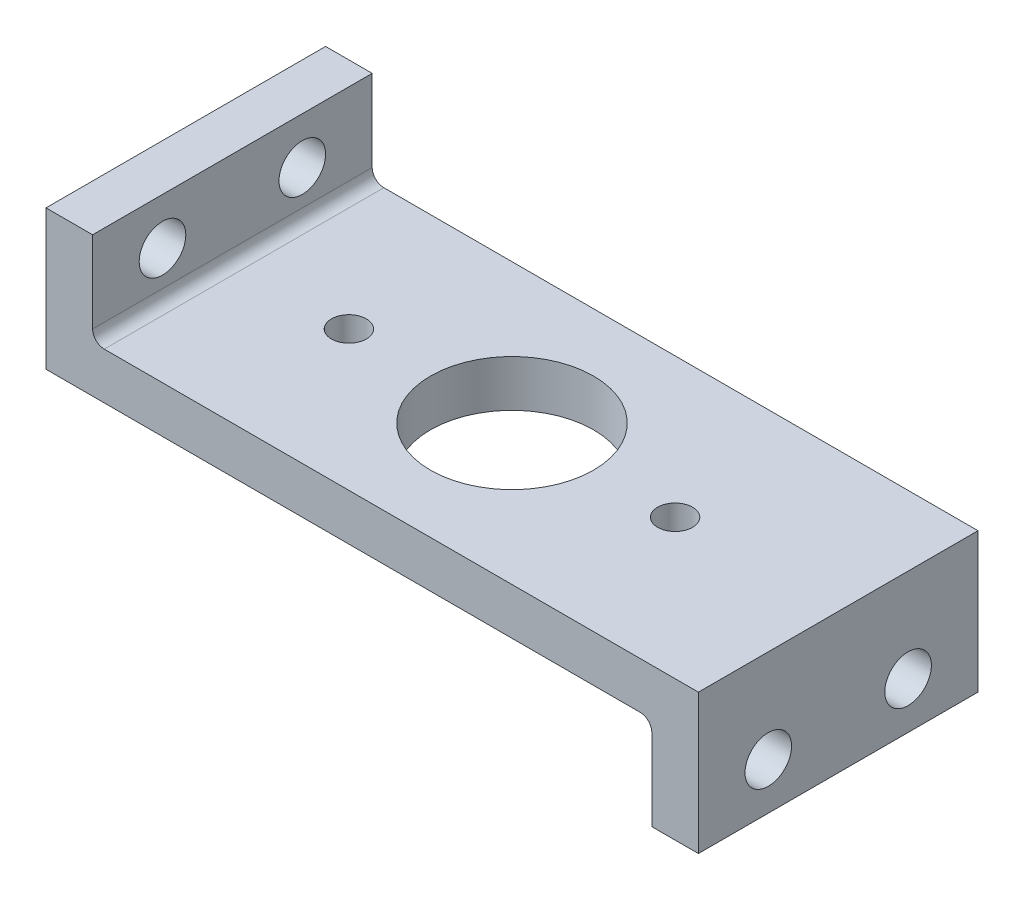
ISO-10303-21;
HEADER;
FILE_DESCRIPTION(('STEP AP214'),'2;1');
FILE_NAME('part.step','',(''),(''),'','','');
FILE_SCHEMA(('AUTOMOTIVE_DESIGN { 1 0 10303 214 1 1 1 1 }'));
ENDSEC;
DATA;
#1=APPLICATION_CONTEXT('core data for automotive mechanical design processes');
#2=APPLICATION_PROTOCOL_DEFINITION('international standard','automotive_design',2000,#1);
#3=PRODUCT_CONTEXT('',#1,'mechanical');
#4=PRODUCT('Part','Part','',(#3));
#5=PRODUCT_RELATED_PRODUCT_CATEGORY('part','',(#4));
#6=PRODUCT_DEFINITION_FORMATION('','',#4);
#7=PRODUCT_DEFINITION_CONTEXT('part definition',#1,'design');
#8=PRODUCT_DEFINITION('design','',#6,#7);
#9=PRODUCT_DEFINITION_SHAPE('','',#8);
#10=(LENGTH_UNIT() NAMED_UNIT(*) SI_UNIT(.MILLI.,.METRE.));
#11=(NAMED_UNIT(*) PLANE_ANGLE_UNIT() SI_UNIT($,.RADIAN.));
#12=(NAMED_UNIT(*) SI_UNIT($,.STERADIAN.) SOLID_ANGLE_UNIT());
#13=UNCERTAINTY_MEASURE_WITH_UNIT(LENGTH_MEASURE(1.E-05),#10,'distance_accuracy_value','');
#14=(GEOMETRIC_REPRESENTATION_CONTEXT(3) GLOBAL_UNCERTAINTY_ASSIGNED_CONTEXT((#13)) GLOBAL_UNIT_ASSIGNED_CONTEXT((#10,
#11,#12)) REPRESENTATION_CONTEXT('',''));
#15=CARTESIAN_POINT('',(0.,0.,0.));
#16=DIRECTION('',(0.,0.,1.));
#17=DIRECTION('',(1.,0.,0.));
#18=AXIS2_PLACEMENT_3D('',#15,#16,#17);
#19=CARTESIAN_POINT('',(0.,0.,0.));
#20=DIRECTION('',(0.,1.,0.));
#21=DIRECTION('',(0.,0.,1.));
#22=AXIS2_PLACEMENT_3D('',#19,#20,#21);
#23=PLANE('',#22);
#24=CARTESIAN_POINT('',(44.45,0.,0.));
#25=DIRECTION('',(0.,1.,0.));
#26=DIRECTION('',(0.,0.,1.));
#27=AXIS2_PLACEMENT_3D('',#24,#25,#26);
#28=CIRCLE('',#27,4.7625);
#29=CARTESIAN_POINT('',(44.45,0.,4.7625));
#30=VERTEX_POINT('',#29);
#31=EDGE_CURVE('E199',#30,#30,#28,.T.);
#32=ORIENTED_EDGE('',*,*,#31,.T.);
#33=EDGE_LOOP('',(#32));
#34=FACE_BOUND('',#33,.T.);
#35=CARTESIAN_POINT('',(-44.45,0.,0.));
#36=DIRECTION('',(0.,1.,0.));
#37=DIRECTION('',(0.,0.,1.));
#38=AXIS2_PLACEMENT_3D('',#35,#36,#37);
#39=CIRCLE('',#38,4.7625);
#40=CARTESIAN_POINT('',(-44.45,0.,4.7625));
#41=VERTEX_POINT('',#40);
#42=EDGE_CURVE('E204',#41,#41,#39,.T.);
#43=ORIENTED_EDGE('',*,*,#42,.T.);
#44=EDGE_LOOP('',(#43));
#45=FACE_BOUND('',#44,.T.);
#46=CARTESIAN_POINT('',(0.,0.,0.));
#47=DIRECTION('',(0.,1.,0.));
#48=DIRECTION('',(0.,0.,1.));
#49=AXIS2_PLACEMENT_3D('',#46,#47,#48);
#50=CIRCLE('',#49,22.225);
#51=CARTESIAN_POINT('',(0.,0.,22.225));
#52=VERTEX_POINT('',#51);
#53=EDGE_CURVE('E212',#52,#52,#50,.T.);
#54=ORIENTED_EDGE('',*,*,#53,.T.);
#55=EDGE_LOOP('',(#54));
#56=FACE_BOUND('',#55,.T.);
#57=DIRECTION('',(-1.,0.,0.));
#58=VECTOR('',#57,1.);
#59=CARTESIAN_POINT('',(-88.9,0.,-38.1));
#60=LINE('',#59,#58);
#61=CARTESIAN_POINT('',(73.025,0.,-38.1));
#62=VERTEX_POINT('',#61);
#63=CARTESIAN_POINT('',(-88.9,0.,-38.1));
#64=VERTEX_POINT('',#63);
#65=EDGE_CURVE('E227',#62,#64,#60,.T.);
#66=ORIENTED_EDGE('',*,*,#65,.F.);
#67=DIRECTION('',(0.,0.,-1.));
#68=VECTOR('',#67,1.);
#69=CARTESIAN_POINT('',(73.025,0.,38.1));
#70=LINE('',#69,#68);
#71=CARTESIAN_POINT('',(73.025,0.,38.1));
#72=VERTEX_POINT('',#71);
#73=EDGE_CURVE('E265',#62,#72,#70,.F.);
#74=ORIENTED_EDGE('',*,*,#73,.T.);
#75=DIRECTION('',(1.,0.,0.));
#76=VECTOR('',#75,1.);
#77=CARTESIAN_POINT('',(-88.9,0.,38.1));
#78=LINE('',#77,#76);
#79=CARTESIAN_POINT('',(-88.9,0.,38.1));
#80=VERTEX_POINT('',#79);
#81=EDGE_CURVE('E237',#80,#72,#78,.T.);
#82=ORIENTED_EDGE('',*,*,#81,.F.);
#83=DIRECTION('',(0.,0.,1.));
#84=VECTOR('',#83,1.);
#85=CARTESIAN_POINT('',(-88.9,0.,-38.1));
#86=LINE('',#85,#84);
#87=EDGE_CURVE('E220',#64,#80,#86,.T.);
#88=ORIENTED_EDGE('',*,*,#87,.F.);
#89=EDGE_LOOP('',(#66,#74,#82,#88));
#90=FACE_BOUND('',#89,.T.);
#91=ADVANCED_FACE('F51',(#34,#45,#56,#90),#23,.F.);
#92=CARTESIAN_POINT('',(0.,12.7,0.));
#93=DIRECTION('',(0.,1.,0.));
#94=DIRECTION('',(0.,0.,1.));
#95=AXIS2_PLACEMENT_3D('',#92,#93,#94);
#96=PLANE('',#95);
#97=DIRECTION('',(-1.,0.,0.));
#98=VECTOR('',#97,1.);
#99=CARTESIAN_POINT('',(-88.9,12.7,-38.1));
#100=LINE('',#99,#98);
#101=CARTESIAN_POINT('',(88.9,12.7,-38.1));
#102=VERTEX_POINT('',#101);
#103=CARTESIAN_POINT('',(-73.025,12.7,-38.1));
#104=VERTEX_POINT('',#103);
#105=EDGE_CURVE('E230',#102,#104,#100,.T.);
#106=ORIENTED_EDGE('',*,*,#105,.T.);
#107=DIRECTION('',(0.,0.,-1.));
#108=VECTOR('',#107,1.);
#109=CARTESIAN_POINT('',(-73.025,12.7,0.));
#110=LINE('',#109,#108);
#111=CARTESIAN_POINT('',(-73.025,12.7,38.1));
#112=VERTEX_POINT('',#111);
#113=EDGE_CURVE('E73',#104,#112,#110,.F.);
#114=ORIENTED_EDGE('',*,*,#113,.T.);
#115=DIRECTION('',(1.,0.,0.));
#116=VECTOR('',#115,1.);
#117=CARTESIAN_POINT('',(-88.9,12.7,38.1));
#118=LINE('',#117,#116);
#119=CARTESIAN_POINT('',(88.9,12.7,38.1));
#120=VERTEX_POINT('',#119);
#121=EDGE_CURVE('E224',#112,#120,#118,.T.);
#122=ORIENTED_EDGE('',*,*,#121,.T.);
#123=DIRECTION('',(0.,0.,-1.));
#124=VECTOR('',#123,1.);
#125=CARTESIAN_POINT('',(88.9,12.7,-38.1));
#126=LINE('',#125,#124);
#127=EDGE_CURVE('E135',#120,#102,#126,.T.);
#128=ORIENTED_EDGE('',*,*,#127,.T.);
#129=EDGE_LOOP('',(#106,#114,#122,#128));
#130=FACE_BOUND('',#129,.T.);
#131=CARTESIAN_POINT('',(-44.45,12.7,0.));
#132=DIRECTION('',(0.,1.,0.));
#133=DIRECTION('',(0.,0.,1.));
#134=AXIS2_PLACEMENT_3D('',#131,#132,#133);
#135=CIRCLE('',#134,4.7625);
#136=CARTESIAN_POINT('',(-44.45,12.7,4.7625));
#137=VERTEX_POINT('',#136);
#138=EDGE_CURVE('E208',#137,#137,#135,.T.);
#139=ORIENTED_EDGE('',*,*,#138,.F.);
#140=EDGE_LOOP('',(#139));
#141=FACE_BOUND('',#140,.T.);
#142=CARTESIAN_POINT('',(0.,12.7,0.));
#143=DIRECTION('',(0.,1.,0.));
#144=DIRECTION('',(0.,0.,1.));
#145=AXIS2_PLACEMENT_3D('',#142,#143,#144);
#146=CIRCLE('',#145,22.225);
#147=CARTESIAN_POINT('',(0.,12.7,22.225));
#148=VERTEX_POINT('',#147);
#149=EDGE_CURVE('E216',#148,#148,#146,.T.);
#150=ORIENTED_EDGE('',*,*,#149,.F.);
#151=EDGE_LOOP('',(#150));
#152=FACE_BOUND('',#151,.T.);
#153=CARTESIAN_POINT('',(44.45,12.7,0.));
#154=DIRECTION('',(0.,1.,0.));
#155=DIRECTION('',(0.,0.,1.));
#156=AXIS2_PLACEMENT_3D('',#153,#154,#155);
#157=CIRCLE('',#156,4.7625);
#158=CARTESIAN_POINT('',(44.45,12.7,4.7625));
#159=VERTEX_POINT('',#158);
#160=EDGE_CURVE('E200',#159,#159,#157,.T.);
#161=ORIENTED_EDGE('',*,*,#160,.F.);
#162=EDGE_LOOP('',(#161));
#163=FACE_BOUND('',#162,.T.);
#164=ADVANCED_FACE('F342',(#130,#141,#152,#163),#96,.T.);
#165=CARTESIAN_POINT('',(-88.9,12.7,-38.1));
#166=DIRECTION('',(1.,0.,0.));
#167=DIRECTION('',(0.,0.,-1.));
#168=AXIS2_PLACEMENT_3D('',#165,#166,#167);
#169=PLANE('',#168);
#170=CARTESIAN_POINT('',(-88.9,25.4,-19.05));
#171=DIRECTION('',(1.,0.,0.));
#172=DIRECTION('',(0.,0.,-1.));
#173=AXIS2_PLACEMENT_3D('',#170,#171,#172);
#174=CIRCLE('',#173,6.35);
#175=CARTESIAN_POINT('',(-88.9,25.4,-25.4));
#176=VERTEX_POINT('',#175);
#177=EDGE_CURVE('E600',#176,#176,#174,.T.);
#178=ORIENTED_EDGE('',*,*,#177,.T.);
#179=EDGE_LOOP('',(#178));
#180=FACE_BOUND('',#179,.T.);
#181=CARTESIAN_POINT('',(-88.9,25.4,19.05));
#182=DIRECTION('',(1.,0.,0.));
#183=DIRECTION('',(0.,0.,-1.));
#184=AXIS2_PLACEMENT_3D('',#181,#182,#183);
#185=CIRCLE('',#184,6.35);
#186=CARTESIAN_POINT('',(-88.9,25.4,12.7));
#187=VERTEX_POINT('',#186);
#188=EDGE_CURVE('E165',#187,#187,#185,.T.);
#189=ORIENTED_EDGE('',*,*,#188,.T.);
#190=EDGE_LOOP('',(#189));
#191=FACE_BOUND('',#190,.T.);
#192=ORIENTED_EDGE('',*,*,#87,.T.);
#193=DIRECTION('',(0.,-1.,0.));
#194=VECTOR('',#193,1.);
#195=CARTESIAN_POINT('',(-88.9,12.7,38.1));
#196=LINE('',#195,#194);
#197=CARTESIAN_POINT('',(-88.9,38.1,38.1));
#198=VERTEX_POINT('',#197);
#199=EDGE_CURVE('E138',#198,#80,#196,.T.);
#200=ORIENTED_EDGE('',*,*,#199,.F.);
#201=DIRECTION('',(0.,0.,1.));
#202=VECTOR('',#201,1.);
#203=CARTESIAN_POINT('',(-88.9,38.1,-38.1));
#204=LINE('',#203,#202);
#205=CARTESIAN_POINT('',(-88.9,38.1,-38.1));
#206=VERTEX_POINT('',#205);
#207=EDGE_CURVE('E178',#206,#198,#204,.T.);
#208=ORIENTED_EDGE('',*,*,#207,.F.);
#209=DIRECTION('',(0.,-1.,0.));
#210=VECTOR('',#209,1.);
#211=CARTESIAN_POINT('',(-88.9,12.7,-38.1));
#212=LINE('',#211,#210);
#213=EDGE_CURVE('E233',#206,#64,#212,.T.);
#214=ORIENTED_EDGE('',*,*,#213,.T.);
#215=EDGE_LOOP('',(#192,#200,#208,#214));
#216=FACE_BOUND('',#215,.T.);
#217=ADVANCED_FACE('F328',(#180,#191,#216),#169,.F.);
#218=CARTESIAN_POINT('',(-88.9,12.7,38.1));
#219=DIRECTION('',(0.,0.,-1.));
#220=DIRECTION('',(-1.,0.,0.));
#221=AXIS2_PLACEMENT_3D('',#218,#219,#220);
#222=PLANE('',#221);
#223=ORIENTED_EDGE('',*,*,#81,.T.);
#224=CARTESIAN_POINT('',(73.025,-3.175,38.1));
#225=DIRECTION('',(0.,0.,-1.));
#226=DIRECTION('',(-1.,0.,0.));
#227=AXIS2_PLACEMENT_3D('',#224,#225,#226);
#228=CIRCLE('',#227,3.175);
#229=CARTESIAN_POINT('',(76.2,-3.175,38.1));
#230=VERTEX_POINT('',#229);
#231=EDGE_CURVE('E277',#72,#230,#228,.T.);
#232=ORIENTED_EDGE('',*,*,#231,.T.);
#233=DIRECTION('',(0.,1.,0.));
#234=VECTOR('',#233,1.);
#235=CARTESIAN_POINT('',(76.2,-25.4,38.1));
#236=LINE('',#235,#234);
#237=CARTESIAN_POINT('',(76.2,-25.4,38.1));
#238=VERTEX_POINT('',#237);
#239=EDGE_CURVE('E146',#238,#230,#236,.T.);
#240=ORIENTED_EDGE('',*,*,#239,.F.);
#241=DIRECTION('',(-1.,0.,0.));
#242=VECTOR('',#241,1.);
#243=CARTESIAN_POINT('',(88.9,-25.4,38.1));
#244=LINE('',#243,#242);
#245=CARTESIAN_POINT('',(88.9,-25.4,38.1));
#246=VERTEX_POINT('',#245);
#247=EDGE_CURVE('E142',#246,#238,#244,.T.);
#248=ORIENTED_EDGE('',*,*,#247,.F.);
#249=DIRECTION('',(0.,-1.,0.));
#250=VECTOR('',#249,1.);
#251=CARTESIAN_POINT('',(88.9,12.7,38.1));
#252=LINE('',#251,#250);
#253=EDGE_CURVE('E129',#120,#246,#252,.T.);
#254=ORIENTED_EDGE('',*,*,#253,.F.);
#255=ORIENTED_EDGE('',*,*,#121,.F.);
#256=CARTESIAN_POINT('',(-73.025,15.875,38.1));
#257=DIRECTION('',(0.,0.,-1.));
#258=DIRECTION('',(-1.,0.,0.));
#259=AXIS2_PLACEMENT_3D('',#256,#257,#258);
#260=CIRCLE('',#259,3.175);
#261=CARTESIAN_POINT('',(-76.2,15.875,38.1));
#262=VERTEX_POINT('',#261);
#263=EDGE_CURVE('E13',#112,#262,#260,.T.);
#264=ORIENTED_EDGE('',*,*,#263,.T.);
#265=DIRECTION('',(0.,-1.,0.));
#266=VECTOR('',#265,1.);
#267=CARTESIAN_POINT('',(-76.2,38.1,38.1));
#268=LINE('',#267,#266);
#269=CARTESIAN_POINT('',(-76.2,38.1,38.1));
#270=VERTEX_POINT('',#269);
#271=EDGE_CURVE('E195',#270,#262,#268,.T.);
#272=ORIENTED_EDGE('',*,*,#271,.F.);
#273=DIRECTION('',(1.,0.,0.));
#274=VECTOR('',#273,1.);
#275=CARTESIAN_POINT('',(-88.9,38.1,38.1));
#276=LINE('',#275,#274);
#277=EDGE_CURVE('E182',#198,#270,#276,.T.);
#278=ORIENTED_EDGE('',*,*,#277,.F.);
#279=ORIENTED_EDGE('',*,*,#199,.T.);
#280=EDGE_LOOP('',(#223,#232,#240,#248,#254,#255,#264,#272,#278,#279));
#281=FACE_BOUND('',#280,.T.);
#282=ADVANCED_FACE('F144',(#281),#222,.F.);
#283=CARTESIAN_POINT('',(88.9,12.7,-38.1));
#284=DIRECTION('',(-1.,0.,0.));
#285=DIRECTION('',(0.,0.,1.));
#286=AXIS2_PLACEMENT_3D('',#283,#284,#285);
#287=PLANE('',#286);
#288=CARTESIAN_POINT('',(88.9,-12.7,19.05));
#289=DIRECTION('',(1.,0.,0.));
#290=DIRECTION('',(0.,0.,-1.));
#291=AXIS2_PLACEMENT_3D('',#288,#289,#290);
#292=CIRCLE('',#291,6.35);
#293=CARTESIAN_POINT('',(88.9,-12.7,12.7));
#294=VERTEX_POINT('',#293);
#295=EDGE_CURVE('E595',#294,#294,#292,.T.);
#296=ORIENTED_EDGE('',*,*,#295,.F.);
#297=EDGE_LOOP('',(#296));
#298=FACE_BOUND('',#297,.T.);
#299=CARTESIAN_POINT('',(88.9,-12.7,-19.05));
#300=DIRECTION('',(1.,0.,0.));
#301=DIRECTION('',(0.,0.,-1.));
#302=AXIS2_PLACEMENT_3D('',#299,#300,#301);
#303=CIRCLE('',#302,6.35);
#304=CARTESIAN_POINT('',(88.9,-12.7,-25.4));
#305=VERTEX_POINT('',#304);
#306=EDGE_CURVE('E590',#305,#305,#303,.T.);
#307=ORIENTED_EDGE('',*,*,#306,.F.);
#308=EDGE_LOOP('',(#307));
#309=FACE_BOUND('',#308,.T.);
#310=ORIENTED_EDGE('',*,*,#253,.T.);
#311=DIRECTION('',(0.,0.,1.));
#312=VECTOR('',#311,1.);
#313=CARTESIAN_POINT('',(88.9,-25.4,38.1));
#314=LINE('',#313,#312);
#315=CARTESIAN_POINT('',(88.9,-25.4,-38.1));
#316=VERTEX_POINT('',#315);
#317=EDGE_CURVE('E134',#316,#246,#314,.T.);
#318=ORIENTED_EDGE('',*,*,#317,.F.);
#319=DIRECTION('',(0.,-1.,0.));
#320=VECTOR('',#319,1.);
#321=CARTESIAN_POINT('',(88.9,12.7,-38.1));
#322=LINE('',#321,#320);
#323=EDGE_CURVE('E139',#102,#316,#322,.T.);
#324=ORIENTED_EDGE('',*,*,#323,.F.);
#325=ORIENTED_EDGE('',*,*,#127,.F.);
#326=EDGE_LOOP('',(#310,#318,#324,#325));
#327=FACE_BOUND('',#326,.T.);
#328=ADVANCED_FACE('F131',(#298,#309,#327),#287,.F.);
#329=CARTESIAN_POINT('',(-88.9,12.7,-38.1));
#330=DIRECTION('',(0.,0.,1.));
#331=DIRECTION('',(1.,0.,0.));
#332=AXIS2_PLACEMENT_3D('',#329,#330,#331);
#333=PLANE('',#332);
#334=ORIENTED_EDGE('',*,*,#323,.T.);
#335=DIRECTION('',(1.,0.,0.));
#336=VECTOR('',#335,1.);
#337=CARTESIAN_POINT('',(88.9,-25.4,-38.1));
#338=LINE('',#337,#336);
#339=CARTESIAN_POINT('',(76.2,-25.4,-38.1));
#340=VERTEX_POINT('',#339);
#341=EDGE_CURVE('E155',#340,#316,#338,.T.);
#342=ORIENTED_EDGE('',*,*,#341,.F.);
#343=DIRECTION('',(0.,1.,0.));
#344=VECTOR('',#343,1.);
#345=CARTESIAN_POINT('',(76.2,-25.4,-38.1));
#346=LINE('',#345,#344);
#347=CARTESIAN_POINT('',(76.2,-3.175,-38.1));
#348=VERTEX_POINT('',#347);
#349=EDGE_CURVE('E172',#340,#348,#346,.T.);
#350=ORIENTED_EDGE('',*,*,#349,.T.);
#351=CARTESIAN_POINT('',(73.025,-3.175,-38.1));
#352=DIRECTION('',(0.,0.,1.));
#353=DIRECTION('',(1.,0.,0.));
#354=AXIS2_PLACEMENT_3D('',#351,#352,#353);
#355=CIRCLE('',#354,3.175);
#356=EDGE_CURVE('E274',#348,#62,#355,.T.);
#357=ORIENTED_EDGE('',*,*,#356,.T.);
#358=ORIENTED_EDGE('',*,*,#65,.T.);
#359=ORIENTED_EDGE('',*,*,#213,.F.);
#360=DIRECTION('',(-1.,0.,0.));
#361=VECTOR('',#360,1.);
#362=CARTESIAN_POINT('',(-88.9,38.1,-38.1));
#363=LINE('',#362,#361);
#364=CARTESIAN_POINT('',(-76.2,38.1,-38.1));
#365=VERTEX_POINT('',#364);
#366=EDGE_CURVE('E188',#365,#206,#363,.T.);
#367=ORIENTED_EDGE('',*,*,#366,.F.);
#368=DIRECTION('',(0.,-1.,0.));
#369=VECTOR('',#368,1.);
#370=CARTESIAN_POINT('',(-76.2,38.1,-38.1));
#371=LINE('',#370,#369);
#372=CARTESIAN_POINT('',(-76.2,15.875,-38.1));
#373=VERTEX_POINT('',#372);
#374=EDGE_CURVE('E192',#365,#373,#371,.T.);
#375=ORIENTED_EDGE('',*,*,#374,.T.);
#376=CARTESIAN_POINT('',(-73.025,15.875,-38.1));
#377=DIRECTION('',(0.,0.,1.));
#378=DIRECTION('',(1.,0.,0.));
#379=AXIS2_PLACEMENT_3D('',#376,#377,#378);
#380=CIRCLE('',#379,3.175);
#381=EDGE_CURVE('E60',#373,#104,#380,.T.);
#382=ORIENTED_EDGE('',*,*,#381,.T.);
#383=ORIENTED_EDGE('',*,*,#105,.F.);
#384=EDGE_LOOP('',(#334,#342,#350,#357,#358,#359,#367,#375,#382,#383));
#385=FACE_BOUND('',#384,.T.);
#386=ADVANCED_FACE('F324',(#385),#333,.F.);
#387=CARTESIAN_POINT('',(0.,12.7,0.));
#388=DIRECTION('',(0.,-1.,0.));
#389=DIRECTION('',(0.,0.,-1.));
#390=AXIS2_PLACEMENT_3D('',#387,#388,#389);
#391=CYLINDRICAL_SURFACE('',#390,22.225);
#392=ORIENTED_EDGE('',*,*,#149,.T.);
#393=EDGE_LOOP('',(#392));
#394=FACE_BOUND('',#393,.T.);
#395=ORIENTED_EDGE('',*,*,#53,.F.);
#396=EDGE_LOOP('',(#395));
#397=FACE_BOUND('',#396,.T.);
#398=ADVANCED_FACE('F366',(#394,#397),#391,.F.);
#399=CARTESIAN_POINT('',(-44.45,12.7,0.));
#400=DIRECTION('',(0.,-1.,0.));
#401=DIRECTION('',(0.,0.,-1.));
#402=AXIS2_PLACEMENT_3D('',#399,#400,#401);
#403=CYLINDRICAL_SURFACE('',#402,4.7625);
#404=ORIENTED_EDGE('',*,*,#138,.T.);
#405=EDGE_LOOP('',(#404));
#406=FACE_BOUND('',#405,.T.);
#407=ORIENTED_EDGE('',*,*,#42,.F.);
#408=EDGE_LOOP('',(#407));
#409=FACE_BOUND('',#408,.T.);
#410=ADVANCED_FACE('F355',(#406,#409),#403,.F.);
#411=CARTESIAN_POINT('',(44.45,12.7,0.));
#412=DIRECTION('',(0.,-1.,0.));
#413=DIRECTION('',(0.,0.,-1.));
#414=AXIS2_PLACEMENT_3D('',#411,#412,#413);
#415=CYLINDRICAL_SURFACE('',#414,4.7625);
#416=ORIENTED_EDGE('',*,*,#160,.T.);
#417=EDGE_LOOP('',(#416));
#418=FACE_BOUND('',#417,.T.);
#419=ORIENTED_EDGE('',*,*,#31,.F.);
#420=EDGE_LOOP('',(#419));
#421=FACE_BOUND('',#420,.T.);
#422=ADVANCED_FACE('F352',(#418,#421),#415,.F.);
#423=CARTESIAN_POINT('',(-76.2,38.1,-38.1));
#424=DIRECTION('',(-1.,0.,0.));
#425=DIRECTION('',(0.,0.,1.));
#426=AXIS2_PLACEMENT_3D('',#423,#424,#425);
#427=PLANE('',#426);
#428=CARTESIAN_POINT('',(-76.2,25.4,-19.05));
#429=DIRECTION('',(-1.,0.,0.));
#430=DIRECTION('',(0.,0.,1.));
#431=AXIS2_PLACEMENT_3D('',#428,#429,#430);
#432=CIRCLE('',#431,6.35);
#433=CARTESIAN_POINT('',(-76.2,25.4,-12.7));
#434=VERTEX_POINT('',#433);
#435=EDGE_CURVE('E157',#434,#434,#432,.T.);
#436=ORIENTED_EDGE('',*,*,#435,.T.);
#437=EDGE_LOOP('',(#436));
#438=FACE_BOUND('',#437,.T.);
#439=CARTESIAN_POINT('',(-76.2,25.4,19.05));
#440=DIRECTION('',(-1.,0.,0.));
#441=DIRECTION('',(0.,0.,1.));
#442=AXIS2_PLACEMENT_3D('',#439,#440,#441);
#443=CIRCLE('',#442,6.35);
#444=CARTESIAN_POINT('',(-76.2,25.4,25.4));
#445=VERTEX_POINT('',#444);
#446=EDGE_CURVE('E162',#445,#445,#443,.T.);
#447=ORIENTED_EDGE('',*,*,#446,.T.);
#448=EDGE_LOOP('',(#447));
#449=FACE_BOUND('',#448,.T.);
#450=ORIENTED_EDGE('',*,*,#271,.T.);
#451=DIRECTION('',(0.,0.,-1.));
#452=VECTOR('',#451,1.);
#453=CARTESIAN_POINT('',(-76.2,15.875,-38.1));
#454=LINE('',#453,#452);
#455=EDGE_CURVE('E268',#262,#373,#454,.T.);
#456=ORIENTED_EDGE('',*,*,#455,.T.);
#457=ORIENTED_EDGE('',*,*,#374,.F.);
#458=DIRECTION('',(0.,0.,-1.));
#459=VECTOR('',#458,1.);
#460=CARTESIAN_POINT('',(-76.2,38.1,-38.1));
#461=LINE('',#460,#459);
#462=EDGE_CURVE('E185',#270,#365,#461,.T.);
#463=ORIENTED_EDGE('',*,*,#462,.F.);
#464=EDGE_LOOP('',(#450,#456,#457,#463));
#465=FACE_BOUND('',#464,.T.);
#466=ADVANCED_FACE('F338',(#438,#449,#465),#427,.F.);
#467=CARTESIAN_POINT('',(0.,38.1,0.));
#468=DIRECTION('',(0.,1.,0.));
#469=DIRECTION('',(0.,0.,1.));
#470=AXIS2_PLACEMENT_3D('',#467,#468,#469);
#471=PLANE('',#470);
#472=ORIENTED_EDGE('',*,*,#207,.T.);
#473=ORIENTED_EDGE('',*,*,#277,.T.);
#474=ORIENTED_EDGE('',*,*,#462,.T.);
#475=ORIENTED_EDGE('',*,*,#366,.T.);
#476=EDGE_LOOP('',(#472,#473,#474,#475));
#477=FACE_BOUND('',#476,.T.);
#478=ADVANCED_FACE('F333',(#477),#471,.T.);
#479=CARTESIAN_POINT('',(76.2,-25.4,38.1));
#480=DIRECTION('',(1.,0.,0.));
#481=DIRECTION('',(0.,0.,-1.));
#482=AXIS2_PLACEMENT_3D('',#479,#480,#481);
#483=PLANE('',#482);
#484=CARTESIAN_POINT('',(76.2,-12.7,19.05));
#485=DIRECTION('',(1.,0.,0.));
#486=DIRECTION('',(0.,0.,-1.));
#487=AXIS2_PLACEMENT_3D('',#484,#485,#486);
#488=CIRCLE('',#487,6.35);
#489=CARTESIAN_POINT('',(76.2,-12.7,12.7));
#490=VERTEX_POINT('',#489);
#491=EDGE_CURVE('E255',#490,#490,#488,.T.);
#492=ORIENTED_EDGE('',*,*,#491,.T.);
#493=EDGE_LOOP('',(#492));
#494=FACE_BOUND('',#493,.T.);
#495=CARTESIAN_POINT('',(76.2,-12.7,-19.05));
#496=DIRECTION('',(1.,0.,0.));
#497=DIRECTION('',(0.,0.,-1.));
#498=AXIS2_PLACEMENT_3D('',#495,#496,#497);
#499=CIRCLE('',#498,6.35);
#500=CARTESIAN_POINT('',(76.2,-12.7,-25.4));
#501=VERTEX_POINT('',#500);
#502=EDGE_CURVE('E251',#501,#501,#499,.T.);
#503=ORIENTED_EDGE('',*,*,#502,.T.);
#504=EDGE_LOOP('',(#503));
#505=FACE_BOUND('',#504,.T.);
#506=ORIENTED_EDGE('',*,*,#239,.T.);
#507=DIRECTION('',(0.,0.,-1.));
#508=VECTOR('',#507,1.);
#509=CARTESIAN_POINT('',(76.2,-3.175,-38.1));
#510=LINE('',#509,#508);
#511=EDGE_CURVE('E250',#230,#348,#510,.T.);
#512=ORIENTED_EDGE('',*,*,#511,.T.);
#513=ORIENTED_EDGE('',*,*,#349,.F.);
#514=DIRECTION('',(0.,0.,-1.));
#515=VECTOR('',#514,1.);
#516=CARTESIAN_POINT('',(76.2,-25.4,38.1));
#517=LINE('',#516,#515);
#518=EDGE_CURVE('E150',#238,#340,#517,.T.);
#519=ORIENTED_EDGE('',*,*,#518,.F.);
#520=EDGE_LOOP('',(#506,#512,#513,#519));
#521=FACE_BOUND('',#520,.T.);
#522=ADVANCED_FACE('F320',(#494,#505,#521),#483,.F.);
#523=CARTESIAN_POINT('',(0.,-25.4,0.));
#524=DIRECTION('',(0.,1.,0.));
#525=DIRECTION('',(0.,0.,1.));
#526=AXIS2_PLACEMENT_3D('',#523,#524,#525);
#527=PLANE('',#526);
#528=ORIENTED_EDGE('',*,*,#317,.T.);
#529=ORIENTED_EDGE('',*,*,#247,.T.);
#530=ORIENTED_EDGE('',*,*,#518,.T.);
#531=ORIENTED_EDGE('',*,*,#341,.T.);
#532=EDGE_LOOP('',(#528,#529,#530,#531));
#533=FACE_BOUND('',#532,.T.);
#534=ADVANCED_FACE('F153',(#533),#527,.F.);
#535=CARTESIAN_POINT('',(-88.9,-12.7,-19.05));
#536=DIRECTION('',(1.,0.,0.));
#537=DIRECTION('',(0.,0.,-1.));
#538=AXIS2_PLACEMENT_3D('',#535,#536,#537);
#539=CYLINDRICAL_SURFACE('',#538,6.35);
#540=ORIENTED_EDGE('',*,*,#306,.T.);
#541=EDGE_LOOP('',(#540));
#542=FACE_BOUND('',#541,.T.);
#543=ORIENTED_EDGE('',*,*,#502,.F.);
#544=EDGE_LOOP('',(#543));
#545=FACE_BOUND('',#544,.T.);
#546=ADVANCED_FACE('F404',(#542,#545),#539,.F.);
#547=CARTESIAN_POINT('',(-88.9,-12.7,19.05));
#548=DIRECTION('',(1.,0.,0.));
#549=DIRECTION('',(0.,0.,-1.));
#550=AXIS2_PLACEMENT_3D('',#547,#548,#549);
#551=CYLINDRICAL_SURFACE('',#550,6.35);
#552=ORIENTED_EDGE('',*,*,#295,.T.);
#553=EDGE_LOOP('',(#552));
#554=FACE_BOUND('',#553,.T.);
#555=ORIENTED_EDGE('',*,*,#491,.F.);
#556=EDGE_LOOP('',(#555));
#557=FACE_BOUND('',#556,.T.);
#558=ADVANCED_FACE('F397',(#554,#557),#551,.F.);
#559=CARTESIAN_POINT('',(-88.9,25.4,19.05));
#560=DIRECTION('',(1.,0.,0.));
#561=DIRECTION('',(0.,0.,-1.));
#562=AXIS2_PLACEMENT_3D('',#559,#560,#561);
#563=CYLINDRICAL_SURFACE('',#562,6.35);
#564=ORIENTED_EDGE('',*,*,#188,.F.);
#565=EDGE_LOOP('',(#564));
#566=FACE_BOUND('',#565,.T.);
#567=ORIENTED_EDGE('',*,*,#446,.F.);
#568=EDGE_LOOP('',(#567));
#569=FACE_BOUND('',#568,.T.);
#570=ADVANCED_FACE('F391',(#566,#569),#563,.F.);
#571=CARTESIAN_POINT('',(-88.9,25.4,-19.05));
#572=DIRECTION('',(1.,0.,0.));
#573=DIRECTION('',(0.,0.,-1.));
#574=AXIS2_PLACEMENT_3D('',#571,#572,#573);
#575=CYLINDRICAL_SURFACE('',#574,6.35);
#576=ORIENTED_EDGE('',*,*,#177,.F.);
#577=EDGE_LOOP('',(#576));
#578=FACE_BOUND('',#577,.T.);
#579=ORIENTED_EDGE('',*,*,#435,.F.);
#580=EDGE_LOOP('',(#579));
#581=FACE_BOUND('',#580,.T.);
#582=ADVANCED_FACE('F386',(#578,#581),#575,.F.);
#583=CARTESIAN_POINT('',(73.025,-3.175,38.1));
#584=DIRECTION('',(0.,0.,1.));
#585=DIRECTION('',(1.,0.,0.));
#586=AXIS2_PLACEMENT_3D('',#583,#584,#585);
#587=CYLINDRICAL_SURFACE('',#586,3.175);
#588=ORIENTED_EDGE('',*,*,#231,.F.);
#589=ORIENTED_EDGE('',*,*,#73,.F.);
#590=ORIENTED_EDGE('',*,*,#356,.F.);
#591=ORIENTED_EDGE('',*,*,#511,.F.);
#592=EDGE_LOOP('',(#588,#589,#590,#591));
#593=FACE_BOUND('',#592,.T.);
#594=ADVANCED_FACE('F322',(#593),#587,.F.);
#595=CARTESIAN_POINT('',(-73.025,15.875,-38.1));
#596=DIRECTION('',(0.,0.,-1.));
#597=DIRECTION('',(-1.,0.,0.));
#598=AXIS2_PLACEMENT_3D('',#595,#596,#597);
#599=CYLINDRICAL_SURFACE('',#598,3.175);
#600=ORIENTED_EDGE('',*,*,#263,.F.);
#601=ORIENTED_EDGE('',*,*,#113,.F.);
#602=ORIENTED_EDGE('',*,*,#381,.F.);
#603=ORIENTED_EDGE('',*,*,#455,.F.);
#604=EDGE_LOOP('',(#600,#601,#602,#603));
#605=FACE_BOUND('',#604,.T.);
#606=ADVANCED_FACE('F53',(#605),#599,.F.);
#607=CLOSED_SHELL('',(#91,#164,#217,#282,#328,#386,#398,#410,#422,#466,#478,#522,#534,#546,#558,
#570,#582,#594,#606));
#608=MANIFOLD_SOLID_BREP('B2',#607);
#609=ADVANCED_BREP_SHAPE_REPRESENTATION('',(#18,#608),#14);
#610=SHAPE_DEFINITION_REPRESENTATION(#9,#609);
ENDSEC;
END-ISO-10303-21;
